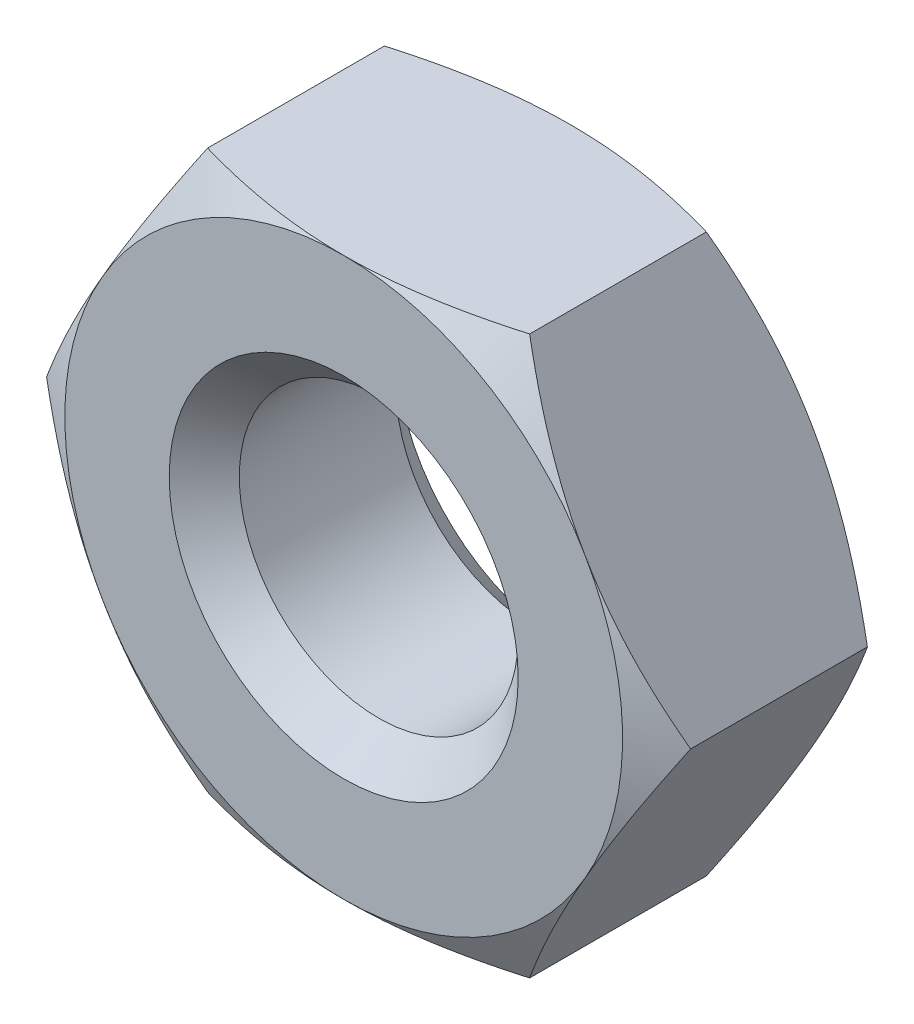
ISO-10303-21;
HEADER;
FILE_DESCRIPTION(('STEP AP214'),'2;1');
FILE_NAME('part.step','',(''),(''),'','','');
FILE_SCHEMA(('AUTOMOTIVE_DESIGN { 1 0 10303 214 1 1 1 1 }'));
ENDSEC;
DATA;
#1=APPLICATION_CONTEXT('core data for automotive mechanical design processes');
#2=APPLICATION_PROTOCOL_DEFINITION('international standard','automotive_design',2000,#1);
#3=PRODUCT_CONTEXT('',#1,'mechanical');
#4=PRODUCT('Part','Part','',(#3));
#5=PRODUCT_RELATED_PRODUCT_CATEGORY('part','',(#4));
#6=PRODUCT_DEFINITION_FORMATION('','',#4);
#7=PRODUCT_DEFINITION_CONTEXT('part definition',#1,'design');
#8=PRODUCT_DEFINITION('design','',#6,#7);
#9=PRODUCT_DEFINITION_SHAPE('','',#8);
#10=(LENGTH_UNIT() NAMED_UNIT(*) SI_UNIT(.MILLI.,.METRE.));
#11=(NAMED_UNIT(*) PLANE_ANGLE_UNIT() SI_UNIT($,.RADIAN.));
#12=(NAMED_UNIT(*) SI_UNIT($,.STERADIAN.) SOLID_ANGLE_UNIT());
#13=UNCERTAINTY_MEASURE_WITH_UNIT(LENGTH_MEASURE(1.E-05),#10,'distance_accuracy_value','');
#14=(GEOMETRIC_REPRESENTATION_CONTEXT(3) GLOBAL_UNCERTAINTY_ASSIGNED_CONTEXT((#13)) GLOBAL_UNIT_ASSIGNED_CONTEXT((#10,
#11,#12)) REPRESENTATION_CONTEXT('',''));
#15=CARTESIAN_POINT('',(0.,0.,0.));
#16=DIRECTION('',(0.,0.,1.));
#17=DIRECTION('',(1.,0.,0.));
#18=AXIS2_PLACEMENT_3D('',#15,#16,#17);
#19=CARTESIAN_POINT('',(0.,0.,0.));
#20=DIRECTION('',(0.,0.,1.));
#21=DIRECTION('',(1.,0.,0.));
#22=AXIS2_PLACEMENT_3D('',#19,#20,#21);
#23=PLANE('',#22);
#24=CARTESIAN_POINT('',(0.,0.,0.));
#25=DIRECTION('',(0.,0.,1.));
#26=DIRECTION('',(1.,0.,0.));
#27=AXIS2_PLACEMENT_3D('',#24,#25,#26);
#28=CIRCLE('',#27,1.00100415278646);
#29=CARTESIAN_POINT('',(1.00100415278646,0.,0.));
#30=VERTEX_POINT('',#29);
#31=EDGE_CURVE('E121',#30,#30,#28,.T.);
#32=ORIENTED_EDGE('',*,*,#31,.T.);
#33=EDGE_LOOP('',(#32));
#34=FACE_BOUND('',#33,.T.);
#35=CARTESIAN_POINT('',(0.,0.,0.));
#36=DIRECTION('',(0.,0.,1.));
#37=DIRECTION('',(1.,0.,0.));
#38=AXIS2_PLACEMENT_3D('',#35,#36,#37);
#39=CIRCLE('',#38,1.59999999999627);
#40=CARTESIAN_POINT('',(1.38564064605904,0.799999999989598,0.));
#41=VERTEX_POINT('',#40);
#42=CARTESIAN_POINT('',(5.98246354959019E-12,1.59999999999814,0.));
#43=VERTEX_POINT('',#42);
#44=EDGE_CURVE('E426',#41,#43,#39,.T.);
#45=ORIENTED_EDGE('',*,*,#44,.F.);
#46=CARTESIAN_POINT('',(0.,0.,0.));
#47=DIRECTION('',(0.,0.,1.));
#48=DIRECTION('',(1.,0.,0.));
#49=AXIS2_PLACEMENT_3D('',#46,#47,#48);
#50=CIRCLE('',#49,1.59999999999627);
#51=CARTESIAN_POINT('',(1.38564064605135,-0.800000000002786,0.));
#52=VERTEX_POINT('',#51);
#53=EDGE_CURVE('E107',#52,#41,#50,.T.);
#54=ORIENTED_EDGE('',*,*,#53,.F.);
#55=CARTESIAN_POINT('',(0.,0.,0.));
#56=DIRECTION('',(0.,0.,1.));
#57=DIRECTION('',(1.,0.,0.));
#58=AXIS2_PLACEMENT_3D('',#55,#56,#57);
#59=CIRCLE('',#58,1.59999999999627);
#60=CARTESIAN_POINT('',(-5.982916792702E-12,-1.59999999999814,0.));
#61=VERTEX_POINT('',#60);
#62=EDGE_CURVE('E20',#61,#52,#59,.T.);
#63=ORIENTED_EDGE('',*,*,#62,.F.);
#64=CARTESIAN_POINT('',(0.,0.,0.));
#65=DIRECTION('',(0.,0.,1.));
#66=DIRECTION('',(1.,0.,0.));
#67=AXIS2_PLACEMENT_3D('',#64,#65,#66);
#68=CIRCLE('',#67,1.59999999999627);
#69=CARTESIAN_POINT('',(-1.38564064605904,-0.799999999989597,0.));
#70=VERTEX_POINT('',#69);
#71=EDGE_CURVE('E104',#70,#61,#68,.T.);
#72=ORIENTED_EDGE('',*,*,#71,.F.);
#73=CARTESIAN_POINT('',(0.,0.,0.));
#74=DIRECTION('',(0.,0.,1.));
#75=DIRECTION('',(1.,0.,0.));
#76=AXIS2_PLACEMENT_3D('',#73,#74,#75);
#77=CIRCLE('',#76,1.59999999999627);
#78=CARTESIAN_POINT('',(-1.38564064605137,0.800000000002749,0.));
#79=VERTEX_POINT('',#78);
#80=EDGE_CURVE('E122',#79,#70,#77,.T.);
#81=ORIENTED_EDGE('',*,*,#80,.F.);
#82=CARTESIAN_POINT('',(0.,0.,0.));
#83=DIRECTION('',(0.,0.,1.));
#84=DIRECTION('',(1.,0.,0.));
#85=AXIS2_PLACEMENT_3D('',#82,#83,#84);
#86=CIRCLE('',#85,1.59999999999627);
#87=EDGE_CURVE('E427',#43,#79,#86,.T.);
#88=ORIENTED_EDGE('',*,*,#87,.F.);
#89=EDGE_LOOP('',(#45,#54,#63,#72,#81,#88));
#90=FACE_BOUND('',#89,.T.);
#91=ADVANCED_FACE('F17',(#34,#90),#23,.F.);
#92=CARTESIAN_POINT('',(0.,0.,0.143763673406738));
#93=DIRECTION('',(0.,0.,1.));
#94=DIRECTION('',(1.,0.,0.));
#95=AXIS2_PLACEMENT_3D('',#92,#93,#94);
#96=CONICAL_SURFACE('',#95,1.84900598662807,1.04719755121154);
#97=CARTESIAN_POINT('',(-1.19654773767804E-11,-1.6,2.15290941782022E-12));
#98=CARTESIAN_POINT('',(0.0392107370444629,-1.6,-5.00000505183459E-06));
#99=CARTESIAN_POINT('',(0.0784161517003311,-1.6,0.000832702442325771));
#100=CARTESIAN_POINT('',(0.156749999056076,-1.6,0.00414952802572509));
#101=CARTESIAN_POINT('',(0.195878445458199,-1.6,0.00662832621231016));
#102=CARTESIAN_POINT('',(0.312668592358511,-1.6,0.0164270649052747));
#103=CARTESIAN_POINT('',(0.390141301552558,-1.6,0.0261102880576585));
#104=CARTESIAN_POINT('',(0.54406520636846,-1.6,0.0510109671173337));
#105=CARTESIAN_POINT('',(0.620517443063267,-1.6,0.0662222507795894));
#106=CARTESIAN_POINT('',(0.772764306430332,-1.6,0.101303114285938));
#107=CARTESIAN_POINT('',(0.848553621805423,-1.6,0.121195958444881));
#108=CARTESIAN_POINT('',(0.923760430704149,-1.6,0.142906235960704));
#109=B_SPLINE_CURVE_WITH_KNOTS('',3,(#97,#98,#99,#100,#101,#102,#103,#104,#105,#106,#107,#108),
.UNSPECIFIED.,.F.,.F.,(4,2,2,2,2,4),(0.,0.117613340321584,0.235203399269671,0.469168717678002,
0.702873605368783,0.937765336056736),.UNSPECIFIED.);
#110=CARTESIAN_POINT('',(0.923760430703587,-1.60000000000032,0.142906235960704));
#111=VERTEX_POINT('',#110);
#112=EDGE_CURVE('E124',#61,#111,#109,.T.);
#113=ORIENTED_EDGE('',*,*,#112,.F.);
#114=ORIENTED_EDGE('',*,*,#62,.T.);
#115=CARTESIAN_POINT('',(0.923760430703025,-1.60000000000065,0.142906235960704));
#116=CARTESIAN_POINT('',(0.961363835151565,-1.53486899295822,0.121195958445358));
#117=CARTESIAN_POINT('',(0.999258492838272,-1.46923352050942,0.101303114286813));
#118=CARTESIAN_POINT('',(1.07538192452012,-1.33738386918996,0.0662222507810298));
#119=CARTESIAN_POINT('',(1.11360804286668,-1.27117429003758,0.0510109671189438));
#120=CARTESIAN_POINT('',(1.19056999527292,-1.13787227822028,0.0261102880593273));
#121=CARTESIAN_POINT('',(1.22930634986908,-1.07077894395973,0.0164270649068317));
#122=CARTESIAN_POINT('',(1.28770142331794,-0.969635709834599,0.00662832621346387));
#123=CARTESIAN_POINT('',(1.30726564651856,-0.935749481240502,0.0041495280267044));
#124=CARTESIAN_POINT('',(1.34643257019556,-0.86791037945577,0.00083270244287824));
#125=CARTESIAN_POINT('',(1.36603527752306,-0.833957494398639,-5.00000475182056E-06));
#126=CARTESIAN_POINT('',(1.38564064605084,-0.800000000007409,2.1626016915323E-12));
#127=B_SPLINE_CURVE_WITH_KNOTS('',3,(#115,#116,#117,#118,#119,#120,#121,#122,#123,#124,#125,
#126),.UNSPECIFIED.,.F.,.F.,(4,2,2,2,2,4),(0.,0.234891730682795,0.468596618368507,
0.702561936771749,0.820151995717245,0.937765336036237),.UNSPECIFIED.);
#128=EDGE_CURVE('E127',#111,#52,#127,.T.);
#129=ORIENTED_EDGE('',*,*,#128,.F.);
#130=EDGE_LOOP('',(#113,#114,#129));
#131=FACE_BOUND('',#130,.T.);
#132=ADVANCED_FACE('F125',(#131),#96,.T.);
#133=CARTESIAN_POINT('',(0.,0.,0.143763673406738));
#134=DIRECTION('',(0.,0.,1.));
#135=DIRECTION('',(1.,0.,0.));
#136=AXIS2_PLACEMENT_3D('',#133,#134,#135);
#137=CONICAL_SURFACE('',#136,1.84900598662807,1.04719755121154);
#138=CARTESIAN_POINT('',(1.84752086140734,-5.94301565502702E-13,0.1429062359608));
#139=CARTESIAN_POINT('',(1.80991745695934,0.0651310070409004,0.121195958445766));
#140=CARTESIAN_POINT('',(1.77202279927318,0.130766479488755,0.10130311428748));
#141=CARTESIAN_POINT('',(1.69589936759244,0.262616130806302,0.0662222507820633));
#142=CARTESIAN_POINT('',(1.65767324924643,0.32882570995772,0.0510109671200867));
#143=CARTESIAN_POINT('',(1.58071129684131,0.462127721773085,0.0261102880605047));
#144=CARTESIAN_POINT('',(1.54197494224571,0.529221056032655,0.0164270649079338));
#145=CARTESIAN_POINT('',(1.48357986879771,0.630364290156311,0.00662832621429832));
#146=CARTESIAN_POINT('',(1.46401564559737,0.664250518749911,0.00414952802742333));
#147=CARTESIAN_POINT('',(1.42484872192094,0.732089620533655,0.000832702443315046));
#148=CARTESIAN_POINT('',(1.40524601459373,0.766042505590292,-5.00000448164722E-06));
#149=CARTESIAN_POINT('',(1.38564064606623,0.799999999981033,2.24143839325845E-12));
#150=B_SPLINE_CURVE_WITH_KNOTS('',3,(#138,#139,#140,#141,#142,#143,#144,#145,#146,#147,#148,
#149),.UNSPECIFIED.,.F.,.F.,(4,2,2,2,2,4),(0.,0.234891730679422,0.468596618361822,
0.702561936761737,0.820151995705539,0.937765336022837),.UNSPECIFIED.);
#151=CARTESIAN_POINT('',(1.84752086140729,0.,0.142906235960772));
#152=VERTEX_POINT('',#151);
#153=EDGE_CURVE('E266',#152,#41,#150,.T.);
#154=ORIENTED_EDGE('',*,*,#153,.F.);
#155=CARTESIAN_POINT('',(1.38564064605084,-0.800000000007409,2.16249419148339E-12));
#156=CARTESIAN_POINT('',(1.40524601457899,-0.766042505615553,-5.00000499336505E-06));
#157=CARTESIAN_POINT('',(1.42484872190685,-0.732089620557791,0.000832702442426975));
#158=CARTESIAN_POINT('',(1.46401564558458,-0.664250518771791,0.00414952802589902));
#159=CARTESIAN_POINT('',(1.48357986878557,-0.630364290177059,0.00662832621251408));
#160=CARTESIAN_POINT('',(1.54197494223552,-0.52922105605004,0.016427064905549));
#161=CARTESIAN_POINT('',(1.5807112968324,-0.462127721788236,0.0261102880579539));
#162=CARTESIAN_POINT('',(1.65767324924008,-0.328825709968453,0.0510109671176248));
#163=CARTESIAN_POINT('',(1.69589936758734,-0.262616130814849,0.0662222507798554));
#164=CARTESIAN_POINT('',(1.77202279927061,-0.130766479492949,0.101303114286116));
#165=CARTESIAN_POINT('',(1.80991745695802,-0.0651310070429276,0.121195958444996));
#166=CARTESIAN_POINT('',(1.84752086140724,6.97129084430837E-13,0.142906235960743));
#167=B_SPLINE_CURVE_WITH_KNOTS('',3,(#155,#156,#157,#158,#159,#160,#161,#162,#163,#164,#165,
#166),.UNSPECIFIED.,.F.,.F.,(4,2,2,2,2,4),(0.,0.117613340321162,0.235203399268828,
0.46916871767633,0.702873605366286,0.9377653360534),.UNSPECIFIED.);
#168=EDGE_CURVE('E267',#52,#152,#167,.T.);
#169=ORIENTED_EDGE('',*,*,#168,.F.);
#170=ORIENTED_EDGE('',*,*,#53,.T.);
#171=EDGE_LOOP('',(#154,#169,#170));
#172=FACE_BOUND('',#171,.T.);
#173=ADVANCED_FACE('F362',(#172),#137,.T.);
#174=CARTESIAN_POINT('',(0.,0.,0.143763673406738));
#175=DIRECTION('',(0.,0.,1.));
#176=DIRECTION('',(1.,0.,0.));
#177=AXIS2_PLACEMENT_3D('',#174,#175,#176);
#178=CONICAL_SURFACE('',#177,1.84900598662807,1.04719755121154);
#179=CARTESIAN_POINT('',(1.38564064606623,0.799999999981033,2.24144054622749E-12));
#180=CARTESIAN_POINT('',(1.3660352775378,0.833957494373376,-5.00000510586898E-06));
#181=CARTESIAN_POINT('',(1.34643257020966,0.867910379431628,0.00083270244214754));
#182=CARTESIAN_POINT('',(1.30726564653136,0.935749481218613,0.00414952802533642));
#183=CARTESIAN_POINT('',(1.28770142333008,0.96963570981384,0.00662832621183524));
#184=CARTESIAN_POINT('',(1.22930634987929,1.07077894394233,0.0164270649045995));
#185=CARTESIAN_POINT('',(1.19056999528184,1.13787227820511,0.0261102880569263));
#186=CARTESIAN_POINT('',(1.11360804287305,1.27117429002682,0.0510109671166247));
#187=CARTESIAN_POINT('',(1.07538192452523,1.33738386918138,0.0662222507789606));
#188=CARTESIAN_POINT('',(0.999258492840876,1.46923352050518,0.101303114285579));
#189=CARTESIAN_POINT('',(0.961363835152919,1.53486899295615,0.121195958444713));
#190=CARTESIAN_POINT('',(0.923760430703153,1.6000000000007,0.142906235960767));
#191=B_SPLINE_CURVE_WITH_KNOTS('',3,(#179,#180,#181,#182,#183,#184,#185,#186,#187,#188,#189,
#190),.UNSPECIFIED.,.F.,.F.,(4,2,2,2,2,4),(0.,0.117613340322848,0.235203399272199,
0.469168717683012,0.702873605376266,0.937765336066735),.UNSPECIFIED.);
#192=CARTESIAN_POINT('',(0.923760430703673,1.60000000000035,0.142906235960742));
#193=VERTEX_POINT('',#192);
#194=EDGE_CURVE('E272',#41,#193,#191,.T.);
#195=ORIENTED_EDGE('',*,*,#194,.F.);
#196=ORIENTED_EDGE('',*,*,#44,.T.);
#197=CARTESIAN_POINT('',(0.923760430704193,1.6,0.142906235960716));
#198=CARTESIAN_POINT('',(0.848553621807388,1.6,0.121195958445448));
#199=CARTESIAN_POINT('',(0.772764306434252,1.6,0.101303114286966));
#200=CARTESIAN_POINT('',(0.620517443071114,1.6,0.0662222507812728));
#201=CARTESIAN_POINT('',(0.544065206378279,1.6,0.0510109671192128));
#202=CARTESIAN_POINT('',(0.390141301566364,1.6,0.0261102880596019));
#203=CARTESIAN_POINT('',(0.312668592374332,1.6,0.0164270649070858));
#204=CARTESIAN_POINT('',(0.195878445477053,1.6,0.00662832621364818));
#205=CARTESIAN_POINT('',(0.156749999075951,1.6,0.00414952802685879));
#206=CARTESIAN_POINT('',(0.0784161517222414,1.6,0.000832702442960025));
#207=CARTESIAN_POINT('',(0.0392107370673868,1.6,-5.00000471272931E-06));
#208=CARTESIAN_POINT('',(1.19651416347265E-11,1.6,2.15290064945078E-12));
#209=B_SPLINE_CURVE_WITH_KNOTS('',3,(#197,#198,#199,#200,#201,#202,#203,#204,#205,#206,#207,
#208),.UNSPECIFIED.,.F.,.F.,(4,2,2,2,2,4),(0.,0.234891730681946,0.468596618366824,
0.702561936769229,0.820151995714298,0.937765336032864),.UNSPECIFIED.);
#210=EDGE_CURVE('E271',#193,#43,#209,.T.);
#211=ORIENTED_EDGE('',*,*,#210,.F.);
#212=EDGE_LOOP('',(#195,#196,#211));
#213=FACE_BOUND('',#212,.T.);
#214=ADVANCED_FACE('F356',(#213),#178,.T.);
#215=CARTESIAN_POINT('',(0.,0.,0.143763673406738));
#216=DIRECTION('',(0.,0.,1.));
#217=DIRECTION('',(1.,0.,0.));
#218=AXIS2_PLACEMENT_3D('',#215,#216,#217);
#219=CONICAL_SURFACE('',#218,1.84900598662807,1.04719755121154);
#220=CARTESIAN_POINT('',(1.19651129515105E-11,1.6,2.15291200091731E-12));
#221=CARTESIAN_POINT('',(-0.0392107370444631,1.6,-5.00000505178684E-06));
#222=CARTESIAN_POINT('',(-0.0784161517003314,1.6,0.000832702442325812));
#223=CARTESIAN_POINT('',(-0.156749999056076,1.6,0.0041495280257251));
#224=CARTESIAN_POINT('',(-0.195878445458199,1.6,0.00662832621231014));
#225=CARTESIAN_POINT('',(-0.312668592358512,1.6,0.0164270649052747));
#226=CARTESIAN_POINT('',(-0.390141301552558,1.6,0.0261102880576586));
#227=CARTESIAN_POINT('',(-0.54406520636846,1.6,0.0510109671173338));
#228=CARTESIAN_POINT('',(-0.620517443063267,1.6,0.0662222507795895));
#229=CARTESIAN_POINT('',(-0.772764306430332,1.6,0.101303114285938));
#230=CARTESIAN_POINT('',(-0.848553621805423,1.6,0.12119595844488));
#231=CARTESIAN_POINT('',(-0.923760430704149,1.6,0.142906235960704));
#232=B_SPLINE_CURVE_WITH_KNOTS('',3,(#220,#221,#222,#223,#224,#225,#226,#227,#228,#229,#230,
#231),.UNSPECIFIED.,.F.,.F.,(4,2,2,2,2,4),(0.,0.117613340321584,0.235203399269671,
0.469168717678001,0.702873605368783,0.937765336056736),.UNSPECIFIED.);
#233=CARTESIAN_POINT('',(-0.923760430703587,1.60000000000032,0.142906235960704));
#234=VERTEX_POINT('',#233);
#235=EDGE_CURVE('E277',#43,#234,#232,.T.);
#236=ORIENTED_EDGE('',*,*,#235,.F.);
#237=ORIENTED_EDGE('',*,*,#87,.T.);
#238=CARTESIAN_POINT('',(-0.923760430703025,1.60000000000065,0.142906235960704));
#239=CARTESIAN_POINT('',(-0.961363835151568,1.53486899295821,0.121195958445356));
#240=CARTESIAN_POINT('',(-0.999258492838279,1.4692335205094,0.101303114286809));
#241=CARTESIAN_POINT('',(-1.07538192452014,1.33738386918994,0.0662222507810238));
#242=CARTESIAN_POINT('',(-1.1136080428667,1.27117429003755,0.0510109671189371));
#243=CARTESIAN_POINT('',(-1.19056999527295,1.13787227822024,0.0261102880593204));
#244=CARTESIAN_POINT('',(-1.22930634986911,1.07077894395968,0.0164270649068253));
#245=CARTESIAN_POINT('',(-1.28770142331797,0.969635709834541,0.00662832621345913));
#246=CARTESIAN_POINT('',(-1.3072656465186,0.93574948124044,0.00414952802670032));
#247=CARTESIAN_POINT('',(-1.3464325701956,0.867910379455701,0.000832702442875862));
#248=CARTESIAN_POINT('',(-1.3660352775231,0.833957494398567,-5.00000475317437E-06));
#249=CARTESIAN_POINT('',(-1.38564064605089,0.800000000007335,2.16249082974627E-12));
#250=B_SPLINE_CURVE_WITH_KNOTS('',3,(#238,#239,#240,#241,#242,#243,#244,#245,#246,#247,#248,
#249),.UNSPECIFIED.,.F.,.F.,(4,2,2,2,2,4),(0.,0.234891730682816,0.46859661836855,
0.702561936771813,0.82015199571732,0.937765336036323),.UNSPECIFIED.);
#251=EDGE_CURVE('E276',#234,#79,#250,.T.);
#252=ORIENTED_EDGE('',*,*,#251,.F.);
#253=EDGE_LOOP('',(#236,#237,#252));
#254=FACE_BOUND('',#253,.T.);
#255=ADVANCED_FACE('F353',(#254),#219,.T.);
#256=CARTESIAN_POINT('',(0.,0.,0.143763673406738));
#257=DIRECTION('',(0.,0.,1.));
#258=DIRECTION('',(1.,0.,0.));
#259=AXIS2_PLACEMENT_3D('',#256,#257,#258);
#260=CONICAL_SURFACE('',#259,1.84900598662807,1.04719755121154);
#261=CARTESIAN_POINT('',(-1.84752086140734,5.84872539850269E-13,0.142906235960797));
#262=CARTESIAN_POINT('',(-1.80991745695934,-0.0651310070409088,0.121195958445763));
#263=CARTESIAN_POINT('',(-1.77202279927318,-0.130766479488763,0.101303114287477));
#264=CARTESIAN_POINT('',(-1.69589936759243,-0.262616130806308,0.0662222507820618));
#265=CARTESIAN_POINT('',(-1.65767324924643,-0.328825709957726,0.0510109671200855));
#266=CARTESIAN_POINT('',(-1.58071129684131,-0.462127721773089,0.0261102880605042));
#267=CARTESIAN_POINT('',(-1.54197494224571,-0.529221056032658,0.0164270649079337));
#268=CARTESIAN_POINT('',(-1.48357986879771,-0.630364290156313,0.0066283262142983));
#269=CARTESIAN_POINT('',(-1.46401564559737,-0.664250518749912,0.00414952802742327));
#270=CARTESIAN_POINT('',(-1.42484872192094,-0.732089620533655,0.000832702443314934));
#271=CARTESIAN_POINT('',(-1.40524601459373,-0.766042505590292,-5.00000448177279E-06));
#272=CARTESIAN_POINT('',(-1.38564064606623,-0.799999999981032,2.24139776496687E-12));
#273=B_SPLINE_CURVE_WITH_KNOTS('',3,(#261,#262,#263,#264,#265,#266,#267,#268,#269,#270,#271,
#272),.UNSPECIFIED.,.F.,.F.,(4,2,2,2,2,4),(0.,0.234891730679419,0.468596618361816,
0.702561936761728,0.820151995705529,0.937765336022825),.UNSPECIFIED.);
#274=CARTESIAN_POINT('',(-1.84752086140729,0.,0.142906235960772));
#275=VERTEX_POINT('',#274);
#276=EDGE_CURVE('E165',#275,#70,#273,.T.);
#277=ORIENTED_EDGE('',*,*,#276,.F.);
#278=CARTESIAN_POINT('',(-1.38564064605089,0.800000000007335,2.16257114548668E-12));
#279=CARTESIAN_POINT('',(-1.40524601457903,0.766042505615481,-5.00000499209238E-06));
#280=CARTESIAN_POINT('',(-1.42484872190689,0.732089620557722,0.000832702442429318));
#281=CARTESIAN_POINT('',(-1.46401564558462,0.664250518771728,0.00414952802590323));
#282=CARTESIAN_POINT('',(-1.48357986878561,0.630364290176998,0.00662832621251908));
#283=CARTESIAN_POINT('',(-1.54197494223555,0.529221056049988,0.0164270649055559));
#284=CARTESIAN_POINT('',(-1.58071129683243,0.462127721788189,0.0261102880579615));
#285=CARTESIAN_POINT('',(-1.6576732492401,0.328825709968416,0.0510109671176327));
#286=CARTESIAN_POINT('',(-1.69589936758736,0.262616130814818,0.0662222507798629));
#287=CARTESIAN_POINT('',(-1.77202279927062,0.130766479492929,0.101303114286122));
#288=CARTESIAN_POINT('',(-1.80991745695802,0.065131007042913,0.121195958445001));
#289=CARTESIAN_POINT('',(-1.84752086140725,-7.06768050650706E-13,0.142906235960746));
#290=B_SPLINE_CURVE_WITH_KNOTS('',3,(#278,#279,#280,#281,#282,#283,#284,#285,#286,#287,#288,
#289),.UNSPECIFIED.,.F.,.F.,(4,2,2,2,2,4),(0.,0.117613340321153,0.235203399268809,
0.469168717676292,0.70287360536623,0.937765336053325),.UNSPECIFIED.);
#291=EDGE_CURVE('E281',#79,#275,#290,.T.);
#292=ORIENTED_EDGE('',*,*,#291,.F.);
#293=ORIENTED_EDGE('',*,*,#80,.T.);
#294=EDGE_LOOP('',(#277,#292,#293));
#295=FACE_BOUND('',#294,.T.);
#296=ADVANCED_FACE('F154',(#295),#260,.T.);
#297=CARTESIAN_POINT('',(0.,0.,0.143763673406738));
#298=DIRECTION('',(0.,0.,1.));
#299=DIRECTION('',(1.,0.,0.));
#300=AXIS2_PLACEMENT_3D('',#297,#298,#299);
#301=CONICAL_SURFACE('',#300,1.84900598662807,1.04719755121154);
#302=CARTESIAN_POINT('',(-1.38564064606623,-0.799999999981032,2.24145232069227E-12));
#303=CARTESIAN_POINT('',(-1.3660352775378,-0.833957494373376,-5.00000510593011E-06));
#304=CARTESIAN_POINT('',(-1.34643257020966,-0.867910379431628,0.000832702442147467));
#305=CARTESIAN_POINT('',(-1.30726564653136,-0.935749481218612,0.00414952802533637));
#306=CARTESIAN_POINT('',(-1.28770142333008,-0.969635709813839,0.00662832621183522));
#307=CARTESIAN_POINT('',(-1.22930634987929,-1.07077894394233,0.0164270649045995));
#308=CARTESIAN_POINT('',(-1.19056999528184,-1.1378722782051,0.0261102880569262));
#309=CARTESIAN_POINT('',(-1.11360804287305,-1.27117429002682,0.0510109671166245));
#310=CARTESIAN_POINT('',(-1.07538192452523,-1.33738386918138,0.0662222507789603));
#311=CARTESIAN_POINT('',(-0.999258492840876,-1.46923352050518,0.101303114285579));
#312=CARTESIAN_POINT('',(-0.96136383515292,-1.53486899295615,0.121195958444713));
#313=CARTESIAN_POINT('',(-0.923760430703153,-1.6000000000007,0.142906235960767));
#314=B_SPLINE_CURVE_WITH_KNOTS('',3,(#302,#303,#304,#305,#306,#307,#308,#309,#310,#311,#312,
#313),.UNSPECIFIED.,.F.,.F.,(4,2,2,2,2,4),(0.,0.117613340322849,0.235203399272199,
0.469168717683012,0.702873605376265,0.937765336066735),.UNSPECIFIED.);
#315=CARTESIAN_POINT('',(-0.923760430703867,-1.60000000000003,0.142906235960639));
#316=VERTEX_POINT('',#315);
#317=EDGE_CURVE('E119',#70,#316,#314,.T.);
#318=ORIENTED_EDGE('',*,*,#317,.F.);
#319=ORIENTED_EDGE('',*,*,#71,.T.);
#320=CARTESIAN_POINT('',(-0.923760430704215,-1.6,0.142906235960723));
#321=CARTESIAN_POINT('',(-0.848553621807409,-1.6,0.121195958445453));
#322=CARTESIAN_POINT('',(-0.772764306434271,-1.6,0.101303114286971));
#323=CARTESIAN_POINT('',(-0.620517443071129,-1.6,0.0662222507812759));
#324=CARTESIAN_POINT('',(-0.544065206378292,-1.6,0.0510109671192151));
#325=CARTESIAN_POINT('',(-0.390141301566374,-1.6,0.0261102880596031));
#326=CARTESIAN_POINT('',(-0.31266859237434,-1.6,0.0164270649070866));
#327=CARTESIAN_POINT('',(-0.195878445477058,-1.6,0.00662832621364853));
#328=CARTESIAN_POINT('',(-0.156749999075955,-1.6,0.004149528026859));
#329=CARTESIAN_POINT('',(-0.0784161517222438,-1.6,0.000832702442960059));
#330=CARTESIAN_POINT('',(-0.0392107370673882,-1.6,-5.0000047127409E-06));
#331=CARTESIAN_POINT('',(-1.19655562308814E-11,-1.6,2.15290904037082E-12));
#332=B_SPLINE_CURVE_WITH_KNOTS('',3,(#320,#321,#322,#323,#324,#325,#326,#327,#328,#329,#330,
#331),.UNSPECIFIED.,.F.,.F.,(4,2,2,2,2,4),(0.,0.234891730681951,0.468596618366836,
0.702561936769246,0.820151995714318,0.937765336032887),.UNSPECIFIED.);
#333=EDGE_CURVE('E116',#316,#61,#332,.T.);
#334=ORIENTED_EDGE('',*,*,#333,.F.);
#335=EDGE_LOOP('',(#318,#319,#334));
#336=FACE_BOUND('',#335,.T.);
#337=ADVANCED_FACE('F114',(#336),#301,.T.);
#338=CARTESIAN_POINT('',(0.,0.,0.000912812424758158));
#339=DIRECTION('',(0.,0.,-1.));
#340=DIRECTION('',(-1.,0.,0.));
#341=AXIS2_PLACEMENT_3D('',#338,#339,#340);
#342=CONICAL_SURFACE('',#341,1.00009042375859,0.785899987779518);
#343=CARTESIAN_POINT('',(0.,0.,0.200802516386069));
#344=DIRECTION('',(0.,0.,-1.));
#345=DIRECTION('',(-1.,0.,0.));
#346=AXIS2_PLACEMENT_3D('',#343,#344,#345);
#347=CIRCLE('',#346,0.8);
#348=CARTESIAN_POINT('',(-0.8,0.,0.200802516386069));
#349=VERTEX_POINT('',#348);
#350=EDGE_CURVE('E166',#349,#349,#347,.F.);
#351=ORIENTED_EDGE('',*,*,#350,.T.);
#352=EDGE_LOOP('',(#351));
#353=FACE_BOUND('',#352,.T.);
#354=ORIENTED_EDGE('',*,*,#31,.F.);
#355=EDGE_LOOP('',(#354));
#356=FACE_BOUND('',#355,.T.);
#357=ADVANCED_FACE('F153',(#353,#356),#342,.F.);
#358=CARTESIAN_POINT('',(-0.9237604307034,-1.6,0.));
#359=DIRECTION('',(0.,-1.,0.));
#360=DIRECTION('',(0.,0.,-1.));
#361=AXIS2_PLACEMENT_3D('',#358,#359,#360);
#362=PLANE('',#361);
#363=CARTESIAN_POINT('',(-1.19652513958752E-11,-1.6,1.30000000001258));
#364=CARTESIAN_POINT('',(0.039210733251833,-1.6,1.30000500001786));
#365=CARTESIAN_POINT('',(0.0784161441166824,-1.6,1.29916729773358));
#366=CARTESIAN_POINT('',(0.156749983913892,-1.6,1.29585047278948));
#367=CARTESIAN_POINT('',(0.195878426548491,-1.6,1.29337167507892));
#368=CARTESIAN_POINT('',(0.312668562292668,-1.6,1.28357293824737));
#369=CARTESIAN_POINT('',(0.390141264151572,-1.6,1.27388971691423));
#370=CARTESIAN_POINT('',(0.544065154566848,-1.6,1.248989042373));
#371=CARTESIAN_POINT('',(0.620517384195597,-1.6,1.23377776140713));
#372=CARTESIAN_POINT('',(0.77276423356162,-1.6,1.19869690391938));
#373=CARTESIAN_POINT('',(0.848553542003557,-1.6,1.17880406308884));
#374=CARTESIAN_POINT('',(0.923760344071973,-1.6,1.15709378906258));
#375=B_SPLINE_CURVE_WITH_KNOTS('',3,(#363,#364,#365,#366,#367,#368,#369,#370,#371,#372,#373,
#374),.UNSPECIFIED.,.F.,.F.,(4,2,2,2,2,4),(0.,0.117613328949189,0.235203376535946,
0.469168672498955,0.702873537847385,0.937765245919384),.UNSPECIFIED.);
#376=CARTESIAN_POINT('',(-1.19652485754078E-11,-1.59999999999814,1.30000000001366));
#377=VERTEX_POINT('',#376);
#378=CARTESIAN_POINT('',(0.923760422370973,-1.60000001443219,1.15709375924352));
#379=VERTEX_POINT('',#378);
#380=EDGE_CURVE('E226',#377,#379,#375,.T.);
#381=ORIENTED_EDGE('',*,*,#380,.F.);
#382=CARTESIAN_POINT('',(-0.923760464030927,-1.6,1.15709375443342));
#383=CARTESIAN_POINT('',(-0.848553652506555,-1.6,1.1788040332911));
#384=CARTESIAN_POINT('',(-0.772764334466287,-1.6,1.19869687872999));
#385=CARTESIAN_POINT('',(-0.620517465717055,-1.6,1.23377774455099));
#386=CARTESIAN_POINT('',(-0.544065226305962,-1.6,1.24898902925033));
#387=CARTESIAN_POINT('',(-0.390141315954237,-1.6,1.27388971004815));
#388=CARTESIAN_POINT('',(-0.312668603940432,-1.6,1.28357293390052));
#389=CARTESIAN_POINT('',(-0.195878452751473,-1.6,1.29337167331003));
#390=CARTESIAN_POINT('',(-0.156750004901033,-1.6,1.29585047167994));
#391=CARTESIAN_POINT('',(-0.078416154639613,-1.6,1.29916729750977));
#392=CARTESIAN_POINT('',(-0.0392107385263825,-1.6,1.30000500002019));
#393=CARTESIAN_POINT('',(-1.19652686486198E-11,-1.6,1.30000000001258));
#394=B_SPLINE_CURVE_WITH_KNOTS('',3,(#382,#383,#384,#385,#386,#387,#388,#389,#390,#391,#392,
#393),.UNSPECIFIED.,.F.,.F.,(4,2,2,2,2,4),(0.,0.23489173938213,0.46859663566194,
0.702561962698887,0.820152026014573,0.937765370708012),.UNSPECIFIED.);
#395=CARTESIAN_POINT('',(-0.923760447367223,-1.60000000000003,1.1570937592438));
#396=VERTEX_POINT('',#395);
#397=EDGE_CURVE('E200',#396,#377,#394,.T.);
#398=ORIENTED_EDGE('',*,*,#397,.F.);
#399=DIRECTION('',(0.,0.,1.));
#400=VECTOR('',#399,1.);
#401=CARTESIAN_POINT('',(-0.923760430703518,-1.60000000000007,0.));
#402=LINE('',#401,#400);
#403=EDGE_CURVE('E134',#316,#396,#402,.T.);
#404=ORIENTED_EDGE('',*,*,#403,.F.);
#405=ORIENTED_EDGE('',*,*,#333,.T.);
#406=ORIENTED_EDGE('',*,*,#112,.T.);
#407=DIRECTION('',(0.,0.,1.));
#408=VECTOR('',#407,1.);
#409=CARTESIAN_POINT('',(0.9237604307034,-1.6,0.));
#410=LINE('',#409,#408);
#411=EDGE_CURVE('E130',#379,#111,#410,.F.);
#412=ORIENTED_EDGE('',*,*,#411,.F.);
#413=EDGE_LOOP('',(#381,#398,#404,#405,#406,#412));
#414=FACE_BOUND('',#413,.T.);
#415=ADVANCED_FACE('F132',(#414),#362,.T.);
#416=CARTESIAN_POINT('',(0.9237604307034,-1.6,0.));
#417=DIRECTION('',(0.866025403784429,-0.500000000000017,0.));
#418=DIRECTION('',(0.500000000000017,0.866025403784429,0.));
#419=AXIS2_PLACEMENT_3D('',#416,#417,#418);
#420=PLANE('',#419);
#421=CARTESIAN_POINT('',(1.38564064605084,-0.800000000007409,1.30000000001257));
#422=CARTESIAN_POINT('',(1.40524601268272,-0.766042508899978,1.3000050000178));
#423=CARTESIAN_POINT('',(1.42484871811513,-0.732089627125247,1.29916729773347));
#424=CARTESIAN_POINT('',(1.46401563801369,-0.664250531884954,1.29585047278929));
#425=CARTESIAN_POINT('',(1.48357985933097,-0.630364306552906,1.29337167507868));
#426=CARTESIAN_POINT('',(1.541974927203,-0.529221082087125,1.28357293824701));
#427=CARTESIAN_POINT('',(1.58071127813241,-0.46212775417757,1.2738897169138));
#428=CARTESIAN_POINT('',(1.65767322333997,-0.328825754828759,1.24898904237246));
#429=CARTESIAN_POINT('',(1.6958993381543,-0.262616181794376,1.23377776140654));
#430=CARTESIAN_POINT('',(1.77202276283723,-0.130766542597409,1.19869690391871));
#431=CARTESIAN_POINT('',(1.80991741705815,-0.0651310761515137,1.17880406308815));
#432=CARTESIAN_POINT('',(1.84752081809232,-7.50229517430836E-08,1.15709378906187));
#433=B_SPLINE_CURVE_WITH_KNOTS('',3,(#421,#422,#423,#424,#425,#426,#427,#428,#429,#430,#431,
#432),.UNSPECIFIED.,.F.,.F.,(4,2,2,2,2,4),(0.,0.117613328949073,0.235203376535713,
0.469168672498497,0.702873537846703,0.93776524591847),.UNSPECIFIED.);
#434=CARTESIAN_POINT('',(1.38564064604922,-0.800000000006473,1.30000000001365));
#435=VERTEX_POINT('',#434);
#436=CARTESIAN_POINT('',(1.84752086973882,-1.44311290888881E-08,1.15709375924376));
#437=VERTEX_POINT('',#436);
#438=EDGE_CURVE('E233',#435,#437,#433,.T.);
#439=ORIENTED_EDGE('',*,*,#438,.F.);
#440=CARTESIAN_POINT('',(0.923760414038546,-1.60000002886437,1.15709375443279));
#441=CARTESIAN_POINT('',(0.961363819800957,-1.53486901954625,1.17880403329063));
#442=CARTESIAN_POINT('',(0.999258478821319,-1.46923354478749,1.19869687872968));
#443=CARTESIAN_POINT('',(1.0753819131964,-1.33738388880323,1.23377774455092));
#444=CARTESIAN_POINT('',(1.11360803290217,-1.27117430729661,1.24898902925035));
#445=CARTESIAN_POINT('',(1.19056998807851,-1.13787229068137,1.2738897100483));
#446=CARTESIAN_POINT('',(1.22930634408565,-1.07077895397693,1.28357293390069));
#447=CARTESIAN_POINT('',(1.28770141968048,-0.969635716134852,1.29337167331018));
#448=CARTESIAN_POINT('',(1.30726564360583,-0.935749486285508,1.29585047168007));
#449=CARTESIAN_POINT('',(1.34643256873678,-0.867910381982456,1.29916729750985));
#450=CARTESIAN_POINT('',(1.36603527679351,-0.833957495662251,1.30000500002023));
#451=CARTESIAN_POINT('',(1.38564064605084,-0.800000000007409,1.30000000001257));
#452=B_SPLINE_CURVE_WITH_KNOTS('',3,(#440,#441,#442,#443,#444,#445,#446,#447,#448,#449,#450,
#451),.UNSPECIFIED.,.F.,.F.,(4,2,2,2,2,4),(0.,0.234891739383559,0.468596635664777,
0.702561962703137,0.820152026019542,0.937765370713699),.UNSPECIFIED.);
#453=EDGE_CURVE('E221',#379,#435,#452,.T.);
#454=ORIENTED_EDGE('',*,*,#453,.F.);
#455=ORIENTED_EDGE('',*,*,#411,.T.);
#456=ORIENTED_EDGE('',*,*,#128,.T.);
#457=ORIENTED_EDGE('',*,*,#168,.T.);
#458=DIRECTION('',(0.,0.,1.));
#459=VECTOR('',#458,1.);
#460=CARTESIAN_POINT('',(1.847520861407,0.,0.));
#461=LINE('',#460,#459);
#462=EDGE_CURVE('E263',#437,#152,#461,.F.);
#463=ORIENTED_EDGE('',*,*,#462,.F.);
#464=EDGE_LOOP('',(#439,#454,#455,#456,#457,#463));
#465=FACE_BOUND('',#464,.T.);
#466=ADVANCED_FACE('F381',(#465),#420,.T.);
#467=CARTESIAN_POINT('',(1.847520861407,0.,0.));
#468=DIRECTION('',(0.866025403784429,0.500000000000017,0.));
#469=DIRECTION('',(-0.500000000000017,0.866025403784429,0.));
#470=AXIS2_PLACEMENT_3D('',#467,#468,#469);
#471=PLANE('',#470);
#472=CARTESIAN_POINT('',(1.38564064606623,0.799999999981033,1.30000000001249));
#473=CARTESIAN_POINT('',(1.3660352794341,0.833957491088902,1.30000500001791));
#474=CARTESIAN_POINT('',(1.34643257400144,0.867910372864074,1.29916729773375));
#475=CARTESIAN_POINT('',(1.30726565410236,0.935749468105254,1.29585047278986));
#476=CARTESIAN_POINT('',(1.28770143278482,0.969635693437748,1.29337167507938));
#477=CARTESIAN_POINT('',(1.22930636491203,1.07077891790485,1.28357293824801));
#478=CARTESIAN_POINT('',(1.19057001398211,1.13787224581529,1.2738897169149));
#479=CARTESIAN_POINT('',(1.11360806877355,1.27117424516584,1.2489890423736));
#480=CARTESIAN_POINT('',(1.07538195395872,1.33738381820109,1.23377776140761));
#481=CARTESIAN_POINT('',(0.999258529274796,1.46923345739978,1.19869690391952));
#482=CARTESIAN_POINT('',(0.961363875053375,1.53486892384653,1.17880406308875));
#483=CARTESIAN_POINT('',(0.923760474018722,1.59999992497593,1.15709378906222));
#484=B_SPLINE_CURVE_WITH_KNOTS('',3,(#472,#473,#474,#475,#476,#477,#478,#479,#480,#481,#482,
#483),.UNSPECIFIED.,.F.,.F.,(4,2,2,2,2,4),(0.,0.11761332895059,0.235203376538746,
0.469168672504506,0.702873537855676,0.937765245930462),.UNSPECIFIED.);
#485=CARTESIAN_POINT('',(1.38564064606455,0.799999999980062,1.30000000001361));
#486=VERTEX_POINT('',#485);
#487=CARTESIAN_POINT('',(0.923760447367746,1.6,1.15709375924366));
#488=VERTEX_POINT('',#487);
#489=EDGE_CURVE('E398',#486,#488,#484,.T.);
#490=ORIENTED_EDGE('',*,*,#489,.F.);
#491=CARTESIAN_POINT('',(1.84752087807063,-2.88622578689993E-08,1.15709375443338));
#492=CARTESIAN_POINT('',(1.80991747230885,0.0651309804547667,1.17880403329082));
#493=CARTESIAN_POINT('',(1.77202281328914,0.130766455212414,1.19869687872951));
#494=CARTESIAN_POINT('',(1.69589937891535,0.262616111194433,1.23377774455022));
#495=CARTESIAN_POINT('',(1.65767325921023,0.328825692699921,1.24898902924947));
#496=CARTESIAN_POINT('',(1.58071130403521,0.46212770931288,1.27388971004726));
#497=CARTESIAN_POINT('',(1.54197494802874,0.529221046016166,1.28357293389967));
#498=CARTESIAN_POINT('',(1.4835798724349,0.630364283856508,1.29337167330938));
#499=CARTESIAN_POINT('',(1.4640156485099,0.664250513705266,1.29585047167938));
#500=CARTESIAN_POINT('',(1.42484872337962,0.732089618007149,1.29916729750942));
#501=CARTESIAN_POINT('',(1.40524601532322,0.766042504326771,1.30000500001996));
#502=CARTESIAN_POINT('',(1.38564064606623,0.799999999981033,1.30000000001249));
#503=B_SPLINE_CURVE_WITH_KNOTS('',3,(#491,#492,#493,#494,#495,#496,#497,#498,#499,#500,#501,
#502),.UNSPECIFIED.,.F.,.F.,(4,2,2,2,2,4),(0.,0.234891739379566,0.468596635656857,
0.702561962691274,0.820152026005673,0.937765370697823),.UNSPECIFIED.);
#504=EDGE_CURVE('E393',#437,#486,#503,.T.);
#505=ORIENTED_EDGE('',*,*,#504,.F.);
#506=ORIENTED_EDGE('',*,*,#462,.T.);
#507=ORIENTED_EDGE('',*,*,#153,.T.);
#508=ORIENTED_EDGE('',*,*,#194,.T.);
#509=DIRECTION('',(0.,0.,1.));
#510=VECTOR('',#509,1.);
#511=CARTESIAN_POINT('',(0.9237604307034,1.6,0.));
#512=LINE('',#511,#510);
#513=EDGE_CURVE('E268',#488,#193,#512,.F.);
#514=ORIENTED_EDGE('',*,*,#513,.F.);
#515=EDGE_LOOP('',(#490,#505,#506,#507,#508,#514));
#516=FACE_BOUND('',#515,.T.);
#517=ADVANCED_FACE('F333',(#516),#471,.T.);
#518=CARTESIAN_POINT('',(0.9237604307034,1.6,0.));
#519=DIRECTION('',(0.,1.,0.));
#520=DIRECTION('',(0.,0.,1.));
#521=AXIS2_PLACEMENT_3D('',#518,#519,#520);
#522=PLANE('',#521);
#523=CARTESIAN_POINT('',(1.19651184795384E-11,1.6,1.30000000001258));
#524=CARTESIAN_POINT('',(-0.0392107332520045,1.6,1.30000500001786));
#525=CARTESIAN_POINT('',(-0.078416144117025,1.6,1.29916729773357));
#526=CARTESIAN_POINT('',(-0.156749983914576,1.6,1.29585047278945));
#527=CARTESIAN_POINT('',(-0.195878426549345,1.6,1.29337167507886));
#528=CARTESIAN_POINT('',(-0.312668562294026,1.6,1.28357293824723));
#529=CARTESIAN_POINT('',(-0.390141264153261,1.6,1.273889716914));
#530=CARTESIAN_POINT('',(-0.544065154569188,1.6,1.24898904237258));
#531=CARTESIAN_POINT('',(-0.620517384198256,1.6,1.23377776140658));
#532=CARTESIAN_POINT('',(-0.772764233564912,1.6,1.19869690391856));
#533=CARTESIAN_POINT('',(-0.848553542007161,1.6,1.17880406308787));
#534=CARTESIAN_POINT('',(-0.923760344075886,1.6,1.15709378906145));
#535=B_SPLINE_CURVE_WITH_KNOTS('',3,(#523,#524,#525,#526,#527,#528,#529,#530,#531,#532,#533,
#534),.UNSPECIFIED.,.F.,.F.,(4,2,2,2,2,4),(0.,0.117613328949703,0.235203376536972,
0.469168672500995,0.702873537850435,0.937765245923455),.UNSPECIFIED.);
#536=CARTESIAN_POINT('',(1.19651024532994E-11,1.59999999999814,1.30000000001366));
#537=VERTEX_POINT('',#536);
#538=CARTESIAN_POINT('',(-0.923760422371951,1.60000001443049,1.15709375924408));
#539=VERTEX_POINT('',#538);
#540=EDGE_CURVE('E318',#537,#539,#535,.T.);
#541=ORIENTED_EDGE('',*,*,#540,.F.);
#542=CARTESIAN_POINT('',(0.923760464032093,1.6,1.15709375443308));
#543=CARTESIAN_POINT('',(0.848553652507628,1.6,1.17880403329081));
#544=CARTESIAN_POINT('',(0.772764334467268,1.6,1.19869687872975));
#545=CARTESIAN_POINT('',(0.620517465717847,1.6,1.23377774455083));
#546=CARTESIAN_POINT('',(0.544065226306659,1.6,1.2489890292502));
#547=CARTESIAN_POINT('',(0.39014131595474,1.6,1.27388971004809));
#548=CARTESIAN_POINT('',(0.312668603940836,1.6,1.28357293390047));
#549=CARTESIAN_POINT('',(0.195878452751727,1.6,1.29337167331001));
#550=CARTESIAN_POINT('',(0.156750004901236,1.6,1.29585047167993));
#551=CARTESIAN_POINT('',(0.0784161546397151,1.6,1.29916729750977));
#552=CARTESIAN_POINT('',(0.0392107385264336,1.6,1.30000500002019));
#553=CARTESIAN_POINT('',(1.19651226213062E-11,1.6,1.30000000001258));
#554=B_SPLINE_CURVE_WITH_KNOTS('',3,(#542,#543,#544,#545,#546,#547,#548,#549,#550,#551,#552,
#553),.UNSPECIFIED.,.F.,.F.,(4,2,2,2,2,4),(0.,0.234891739382434,0.468596635662545,
0.702561962699794,0.820152026015633,0.937765370709225),.UNSPECIFIED.);
#555=EDGE_CURVE('E324',#488,#537,#554,.T.);
#556=ORIENTED_EDGE('',*,*,#555,.F.);
#557=ORIENTED_EDGE('',*,*,#513,.T.);
#558=ORIENTED_EDGE('',*,*,#210,.T.);
#559=ORIENTED_EDGE('',*,*,#235,.T.);
#560=DIRECTION('',(0.,0.,1.));
#561=VECTOR('',#560,1.);
#562=CARTESIAN_POINT('',(-0.9237604307034,1.6,0.));
#563=LINE('',#562,#561);
#564=EDGE_CURVE('E273',#539,#234,#563,.F.);
#565=ORIENTED_EDGE('',*,*,#564,.F.);
#566=EDGE_LOOP('',(#541,#556,#557,#558,#559,#565));
#567=FACE_BOUND('',#566,.T.);
#568=ADVANCED_FACE('F329',(#567),#522,.T.);
#569=CARTESIAN_POINT('',(-0.9237604307034,1.6,0.));
#570=DIRECTION('',(-0.866025403784429,0.500000000000017,0.));
#571=DIRECTION('',(-0.500000000000017,-0.866025403784429,0.));
#572=AXIS2_PLACEMENT_3D('',#569,#570,#571);
#573=PLANE('',#572);
#574=CARTESIAN_POINT('',(-1.38564064605089,0.800000000007334,1.30000000001257));
#575=CARTESIAN_POINT('',(-1.40524601399564,0.766042506625933,1.30000500001913));
#576=CARTESIAN_POINT('',(-1.42484872074037,0.732089622578197,1.29916729762189));
#577=CARTESIAN_POINT('',(-1.46401564325544,0.664250522805987,1.29585047223509));
#578=CARTESIAN_POINT('',(-1.48357986587691,0.630364295215021,1.29337167419492));
#579=CARTESIAN_POINT('',(-1.5419749376108,0.529221064060287,1.28357293607453));
#580=CARTESIAN_POINT('',(-1.58071129107939,0.462127731752756,1.2738897134818));
#581=CARTESIAN_POINT('',(-1.65767324127194,0.328825723769673,1.24898903581219));
#582=CARTESIAN_POINT('',(-1.6958993585323,0.262616146498651,1.23377775297948));
#583=CARTESIAN_POINT('',(-1.7720227880619,0.130766498906993,1.19869689132479));
#584=CARTESIAN_POINT('',(-1.80991744468285,0.0651310283041444,1.17880404818986));
#585=CARTESIAN_POINT('',(-1.84752084808143,2.30802919407415E-08,1.15709377174765));
#586=B_SPLINE_CURVE_WITH_KNOTS('',3,(#574,#575,#576,#577,#578,#579,#580,#581,#582,#583,#584,
#585),.UNSPECIFIED.,.F.,.F.,(4,2,2,2,2,4),(0.,0.117613336822534,0.235203392274974,
0.469168703777348,0.702873584593854,0.937765308323346),.UNSPECIFIED.);
#587=CARTESIAN_POINT('',(-1.38564064604926,0.800000000006398,1.30000000001365));
#588=VERTEX_POINT('',#587);
#589=CARTESIAN_POINT('',(-1.84752085474426,-1.15401975170499E-08,1.15709376790086));
#590=VERTEX_POINT('',#589);
#591=EDGE_CURVE('E35',#588,#590,#586,.T.);
#592=ORIENTED_EDGE('',*,*,#591,.F.);
#593=CARTESIAN_POINT('',(-0.923760414040503,1.60000002886099,1.15709375443392));
#594=CARTESIAN_POINT('',(-0.961363819802763,1.53486901954312,1.17880403329161));
#595=CARTESIAN_POINT('',(-0.999258478822972,1.46923354478463,1.1986968787305));
#596=CARTESIAN_POINT('',(-1.07538191319774,1.3373838888009,1.23377774455148));
#597=CARTESIAN_POINT('',(-1.11360803290336,1.27117430729456,1.24898902925079));
#598=CARTESIAN_POINT('',(-1.19056998807937,1.13787229067987,1.27388971004853));
#599=CARTESIAN_POINT('',(-1.22930634408635,1.07077895397571,1.28357293390084));
#600=CARTESIAN_POINT('',(-1.28770141968095,0.969635716134054,1.29337167331024));
#601=CARTESIAN_POINT('',(-1.3072656436062,0.935749486284854,1.29585047168011));
#602=CARTESIAN_POINT('',(-1.34643256873699,0.867910381982091,1.29916729750986));
#603=CARTESIAN_POINT('',(-1.36603527679364,0.833957495662031,1.30000500002023));
#604=CARTESIAN_POINT('',(-1.38564064605089,0.800000000007335,1.30000000001257));
#605=B_SPLINE_CURVE_WITH_KNOTS('',3,(#593,#594,#595,#596,#597,#598,#599,#600,#601,#602,#603,
#604),.UNSPECIFIED.,.F.,.F.,(4,2,2,2,2,4),(0.,0.234891739382559,0.468596635662789,
0.702561962700157,0.82015202601606,0.937765370709714),.UNSPECIFIED.);
#606=EDGE_CURVE('E313',#539,#588,#605,.T.);
#607=ORIENTED_EDGE('',*,*,#606,.F.);
#608=ORIENTED_EDGE('',*,*,#564,.T.);
#609=ORIENTED_EDGE('',*,*,#251,.T.);
#610=ORIENTED_EDGE('',*,*,#291,.T.);
#611=DIRECTION('',(0.,0.,1.));
#612=VECTOR('',#611,1.);
#613=CARTESIAN_POINT('',(-1.847520861407,0.,0.));
#614=LINE('',#613,#612);
#615=EDGE_CURVE('E278',#590,#275,#614,.F.);
#616=ORIENTED_EDGE('',*,*,#615,.F.);
#617=EDGE_LOOP('',(#592,#607,#608,#609,#610,#616));
#618=FACE_BOUND('',#617,.T.);
#619=ADVANCED_FACE('F178',(#618),#573,.T.);
#620=CARTESIAN_POINT('',(-1.847520861407,0.,0.));
#621=DIRECTION('',(-0.866025403784429,-0.500000000000017,0.));
#622=DIRECTION('',(0.500000000000017,-0.866025403784429,0.));
#623=AXIS2_PLACEMENT_3D('',#620,#621,#622);
#624=PLANE('',#623);
#625=CARTESIAN_POINT('',(-1.38564064606623,-0.799999999981033,1.30000000001249));
#626=CARTESIAN_POINT('',(-1.36603527943407,-0.833957491088946,1.30000500001791));
#627=CARTESIAN_POINT('',(-1.34643257400138,-0.867910372864164,1.29916729773375));
#628=CARTESIAN_POINT('',(-1.30726565410225,-0.935749468105434,1.29585047278985));
#629=CARTESIAN_POINT('',(-1.28770143278469,-0.969635693437973,1.29337167507936));
#630=CARTESIAN_POINT('',(-1.22930636491182,-1.07077891790521,1.28357293824797));
#631=CARTESIAN_POINT('',(-1.19057001398185,-1.13787224581573,1.27388971691483));
#632=CARTESIAN_POINT('',(-1.11360806877319,-1.27117424516646,1.24898904237347));
#633=CARTESIAN_POINT('',(-1.07538195395831,-1.33738381820179,1.23377776140745));
#634=CARTESIAN_POINT('',(-0.999258529274296,-1.46923345740064,1.19869690391927));
#635=CARTESIAN_POINT('',(-0.961363875052828,-1.53486892384748,1.17880406308845));
#636=CARTESIAN_POINT('',(-0.923760474018128,-1.59999992497696,1.15709378906188));
#637=B_SPLINE_CURVE_WITH_KNOTS('',3,(#625,#626,#627,#628,#629,#630,#631,#632,#633,#634,#635,
#636),.UNSPECIFIED.,.F.,.F.,(4,2,2,2,2,4),(0.,0.117613328950746,0.235203376539058,
0.469168672505126,0.702873537856601,0.937765245931698),.UNSPECIFIED.);
#638=CARTESIAN_POINT('',(-1.38564064605904,-0.799999999989597,1.30000000001473));
#639=VERTEX_POINT('',#638);
#640=EDGE_CURVE('E194',#639,#396,#637,.T.);
#641=ORIENTED_EDGE('',*,*,#640,.F.);
#642=CARTESIAN_POINT('',(-1.84752084808153,-2.30803951014695E-08,1.1570937717476));
#643=CARTESIAN_POINT('',(-1.80991744468417,-0.0651310283021235,1.1788040481891));
#644=CARTESIAN_POINT('',(-1.77202278806447,-0.130766498902811,1.19869689132343));
#645=CARTESIAN_POINT('',(-1.69589935853738,-0.262616146490129,1.23377775297728));
#646=CARTESIAN_POINT('',(-1.65767324127828,-0.328825723758972,1.24898903580973));
#647=CARTESIAN_POINT('',(-1.58071129108827,-0.462127731737648,1.27388971347925));
#648=CARTESIAN_POINT('',(-1.54197493762097,-0.529221064042951,1.28357293607215));
#649=CARTESIAN_POINT('',(-1.48357986588901,-0.630364295194333,1.29337167419314));
#650=CARTESIAN_POINT('',(-1.46401564326819,-0.664250522784169,1.29585047223357));
#651=CARTESIAN_POINT('',(-1.42484872075442,-0.732089622554129,1.299167297621));
#652=CARTESIAN_POINT('',(-1.40524601401034,-0.766042506600744,1.30000500001862));
#653=CARTESIAN_POINT('',(-1.38564064606623,-0.799999999981033,1.30000000001249));
#654=B_SPLINE_CURVE_WITH_KNOTS('',3,(#642,#643,#644,#645,#646,#647,#648,#649,#650,#651,#652,
#653),.UNSPECIFIED.,.F.,.F.,(4,2,2,2,2,4),(0.,0.234891723721821,0.468596604530792,
0.702561916025601,0.820151971474189,0.937765308292869),.UNSPECIFIED.);
#655=EDGE_CURVE('E186',#590,#639,#654,.T.);
#656=ORIENTED_EDGE('',*,*,#655,.F.);
#657=ORIENTED_EDGE('',*,*,#615,.T.);
#658=ORIENTED_EDGE('',*,*,#276,.T.);
#659=ORIENTED_EDGE('',*,*,#317,.T.);
#660=ORIENTED_EDGE('',*,*,#403,.T.);
#661=EDGE_LOOP('',(#641,#656,#657,#658,#659,#660));
#662=FACE_BOUND('',#661,.T.);
#663=ADVANCED_FACE('F172',(#662),#624,.T.);
#664=CARTESIAN_POINT('',(0.,0.,0.));
#665=DIRECTION('',(0.,0.,1.));
#666=DIRECTION('',(1.,0.,0.));
#667=AXIS2_PLACEMENT_3D('',#664,#665,#666);
#668=CYLINDRICAL_SURFACE('',#667,0.8);
#669=CARTESIAN_POINT('',(0.,0.,1.09919748362876));
#670=DIRECTION('',(0.,0.,1.));
#671=DIRECTION('',(1.,0.,0.));
#672=AXIS2_PLACEMENT_3D('',#669,#670,#671);
#673=CIRCLE('',#672,0.8);
#674=CARTESIAN_POINT('',(0.8,0.,1.09919748362876));
#675=VERTEX_POINT('',#674);
#676=EDGE_CURVE('E251',#675,#675,#673,.T.);
#677=ORIENTED_EDGE('',*,*,#676,.T.);
#678=EDGE_LOOP('',(#677));
#679=FACE_BOUND('',#678,.T.);
#680=ORIENTED_EDGE('',*,*,#350,.F.);
#681=EDGE_LOOP('',(#680));
#682=FACE_BOUND('',#681,.T.);
#683=ADVANCED_FACE('F177',(#679,#682),#668,.F.);
#684=CARTESIAN_POINT('',(0.,0.,1.156236326608));
#685=DIRECTION('',(0.,0.,-1.));
#686=DIRECTION('',(-1.,0.,0.));
#687=AXIS2_PLACEMENT_3D('',#684,#685,#686);
#688=CONICAL_SURFACE('',#687,1.84900598662807,1.04719755121154);
#689=ORIENTED_EDGE('',*,*,#397,.T.);
#690=CARTESIAN_POINT('',(0.,0.,1.30000000001473));
#691=DIRECTION('',(0.,0.,-1.));
#692=DIRECTION('',(-1.,0.,0.));
#693=AXIS2_PLACEMENT_3D('',#690,#691,#692);
#694=CIRCLE('',#693,1.59999999999627);
#695=EDGE_CURVE('E237',#639,#377,#694,.F.);
#696=ORIENTED_EDGE('',*,*,#695,.F.);
#697=ORIENTED_EDGE('',*,*,#640,.T.);
#698=EDGE_LOOP('',(#689,#696,#697));
#699=FACE_BOUND('',#698,.T.);
#700=ADVANCED_FACE('F205',(#699),#688,.T.);
#701=CARTESIAN_POINT('',(0.,0.,1.156236326608));
#702=DIRECTION('',(0.,0.,-1.));
#703=DIRECTION('',(-1.,0.,0.));
#704=AXIS2_PLACEMENT_3D('',#701,#702,#703);
#705=CONICAL_SURFACE('',#704,1.84900598662807,1.04719755121154);
#706=ORIENTED_EDGE('',*,*,#453,.T.);
#707=CARTESIAN_POINT('',(0.,0.,1.30000000001473));
#708=DIRECTION('',(0.,0.,-1.));
#709=DIRECTION('',(-1.,0.,0.));
#710=AXIS2_PLACEMENT_3D('',#707,#708,#709);
#711=CIRCLE('',#710,1.59999999999627);
#712=EDGE_CURVE('E240',#377,#435,#711,.F.);
#713=ORIENTED_EDGE('',*,*,#712,.F.);
#714=ORIENTED_EDGE('',*,*,#380,.T.);
#715=EDGE_LOOP('',(#706,#713,#714));
#716=FACE_BOUND('',#715,.T.);
#717=ADVANCED_FACE('F209',(#716),#705,.T.);
#718=CARTESIAN_POINT('',(0.,0.,1.156236326608));
#719=DIRECTION('',(0.,0.,-1.));
#720=DIRECTION('',(-1.,0.,0.));
#721=AXIS2_PLACEMENT_3D('',#718,#719,#720);
#722=CONICAL_SURFACE('',#721,1.84900598662807,1.04719755121154);
#723=ORIENTED_EDGE('',*,*,#504,.T.);
#724=CARTESIAN_POINT('',(0.,0.,1.30000000001473));
#725=DIRECTION('',(0.,0.,-1.));
#726=DIRECTION('',(-1.,0.,0.));
#727=AXIS2_PLACEMENT_3D('',#724,#725,#726);
#728=CIRCLE('',#727,1.59999999999627);
#729=EDGE_CURVE('E245',#435,#486,#728,.F.);
#730=ORIENTED_EDGE('',*,*,#729,.F.);
#731=ORIENTED_EDGE('',*,*,#438,.T.);
#732=EDGE_LOOP('',(#723,#730,#731));
#733=FACE_BOUND('',#732,.T.);
#734=ADVANCED_FACE('F215',(#733),#722,.T.);
#735=CARTESIAN_POINT('',(0.,0.,1.156236326608));
#736=DIRECTION('',(0.,0.,-1.));
#737=DIRECTION('',(-1.,0.,0.));
#738=AXIS2_PLACEMENT_3D('',#735,#736,#737);
#739=CONICAL_SURFACE('',#738,1.84900598662807,1.04719755121154);
#740=ORIENTED_EDGE('',*,*,#555,.T.);
#741=CARTESIAN_POINT('',(0.,0.,1.30000000001473));
#742=DIRECTION('',(0.,0.,-1.));
#743=DIRECTION('',(-1.,0.,0.));
#744=AXIS2_PLACEMENT_3D('',#741,#742,#743);
#745=CIRCLE('',#744,1.59999999999627);
#746=EDGE_CURVE('E256',#486,#537,#745,.F.);
#747=ORIENTED_EDGE('',*,*,#746,.F.);
#748=ORIENTED_EDGE('',*,*,#489,.T.);
#749=EDGE_LOOP('',(#740,#747,#748));
#750=FACE_BOUND('',#749,.T.);
#751=ADVANCED_FACE('F403',(#750),#739,.T.);
#752=CARTESIAN_POINT('',(0.,0.,1.156236326608));
#753=DIRECTION('',(0.,0.,-1.));
#754=DIRECTION('',(-1.,0.,0.));
#755=AXIS2_PLACEMENT_3D('',#752,#753,#754);
#756=CONICAL_SURFACE('',#755,1.84900598662807,1.04719755121154);
#757=ORIENTED_EDGE('',*,*,#606,.T.);
#758=CARTESIAN_POINT('',(0.,0.,1.30000000001473));
#759=DIRECTION('',(0.,0.,-1.));
#760=DIRECTION('',(-1.,0.,0.));
#761=AXIS2_PLACEMENT_3D('',#758,#759,#760);
#762=CIRCLE('',#761,1.59999999999627);
#763=EDGE_CURVE('E259',#537,#588,#762,.F.);
#764=ORIENTED_EDGE('',*,*,#763,.F.);
#765=ORIENTED_EDGE('',*,*,#540,.T.);
#766=EDGE_LOOP('',(#757,#764,#765));
#767=FACE_BOUND('',#766,.T.);
#768=ADVANCED_FACE('F305',(#767),#756,.T.);
#769=CARTESIAN_POINT('',(0.,0.,1.156236326608));
#770=DIRECTION('',(0.,0.,-1.));
#771=DIRECTION('',(-1.,0.,0.));
#772=AXIS2_PLACEMENT_3D('',#769,#770,#771);
#773=CONICAL_SURFACE('',#772,1.84900598662807,1.04719755121154);
#774=ORIENTED_EDGE('',*,*,#655,.T.);
#775=CARTESIAN_POINT('',(0.,0.,1.30000000001473));
#776=DIRECTION('',(0.,0.,-1.));
#777=DIRECTION('',(-1.,0.,0.));
#778=AXIS2_PLACEMENT_3D('',#775,#776,#777);
#779=CIRCLE('',#778,1.59999999999627);
#780=EDGE_CURVE('E26',#588,#639,#779,.F.);
#781=ORIENTED_EDGE('',*,*,#780,.F.);
#782=ORIENTED_EDGE('',*,*,#591,.T.);
#783=EDGE_LOOP('',(#774,#781,#782));
#784=FACE_BOUND('',#783,.T.);
#785=ADVANCED_FACE('F299',(#784),#773,.T.);
#786=CARTESIAN_POINT('',(0.,0.,1.29908718747629));
#787=DIRECTION('',(0.,0.,1.));
#788=DIRECTION('',(1.,0.,0.));
#789=AXIS2_PLACEMENT_3D('',#786,#787,#788);
#790=CONICAL_SURFACE('',#789,1.00009042370175,0.785899987922085);
#791=ORIENTED_EDGE('',*,*,#676,.F.);
#792=EDGE_LOOP('',(#791));
#793=FACE_BOUND('',#792,.T.);
#794=CARTESIAN_POINT('',(0.,0.,1.3));
#795=DIRECTION('',(0.,0.,1.));
#796=DIRECTION('',(1.,0.,0.));
#797=AXIS2_PLACEMENT_3D('',#794,#795,#796);
#798=CIRCLE('',#797,1.00100415282893);
#799=CARTESIAN_POINT('',(1.00100415282893,0.,1.3));
#800=VERTEX_POINT('',#799);
#801=EDGE_CURVE('E11',#800,#800,#798,.F.);
#802=ORIENTED_EDGE('',*,*,#801,.F.);
#803=EDGE_LOOP('',(#802));
#804=FACE_BOUND('',#803,.T.);
#805=ADVANCED_FACE('F293',(#793,#804),#790,.F.);
#806=CARTESIAN_POINT('',(0.,0.,1.3));
#807=DIRECTION('',(0.,0.,1.));
#808=DIRECTION('',(1.,0.,0.));
#809=AXIS2_PLACEMENT_3D('',#806,#807,#808);
#810=PLANE('',#809);
#811=ORIENTED_EDGE('',*,*,#801,.T.);
#812=EDGE_LOOP('',(#811));
#813=FACE_BOUND('',#812,.T.);
#814=ORIENTED_EDGE('',*,*,#763,.T.);
#815=ORIENTED_EDGE('',*,*,#780,.T.);
#816=ORIENTED_EDGE('',*,*,#695,.T.);
#817=ORIENTED_EDGE('',*,*,#712,.T.);
#818=ORIENTED_EDGE('',*,*,#729,.T.);
#819=ORIENTED_EDGE('',*,*,#746,.T.);
#820=EDGE_LOOP('',(#814,#815,#816,#817,#818,#819));
#821=FACE_BOUND('',#820,.T.);
#822=ADVANCED_FACE('F249',(#813,#821),#810,.T.);
#823=CLOSED_SHELL('',(#91,#132,#173,#214,#255,#296,#337,#357,#415,#466,#517,#568,#619,#663,#683,
#700,#717,#734,#751,#768,#785,#805,#822));
#824=MANIFOLD_SOLID_BREP('B1',#823);
#825=ADVANCED_BREP_SHAPE_REPRESENTATION('',(#18,#824),#14);
#826=SHAPE_DEFINITION_REPRESENTATION(#9,#825);
ENDSEC;
END-ISO-10303-21;
